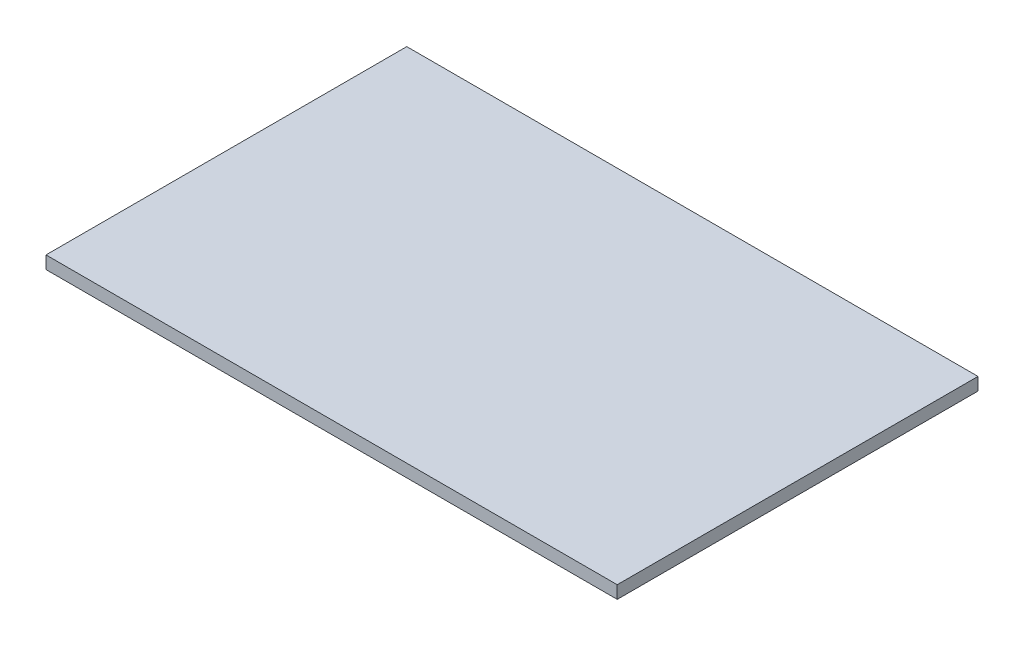
ISO-10303-21;
HEADER;
FILE_DESCRIPTION(('STEP AP214'),'2;1');
FILE_NAME('part.step','',(''),(''),'','','');
FILE_SCHEMA(('AUTOMOTIVE_DESIGN { 1 0 10303 214 1 1 1 1 }'));
ENDSEC;
DATA;
#1=APPLICATION_CONTEXT('core data for automotive mechanical design processes');
#2=APPLICATION_PROTOCOL_DEFINITION('international standard','automotive_design',2000,#1);
#3=PRODUCT_CONTEXT('',#1,'mechanical');
#4=PRODUCT('Part','Part','',(#3));
#5=PRODUCT_RELATED_PRODUCT_CATEGORY('part','',(#4));
#6=PRODUCT_DEFINITION_FORMATION('','',#4);
#7=PRODUCT_DEFINITION_CONTEXT('part definition',#1,'design');
#8=PRODUCT_DEFINITION('design','',#6,#7);
#9=PRODUCT_DEFINITION_SHAPE('','',#8);
#10=(LENGTH_UNIT() NAMED_UNIT(*) SI_UNIT(.MILLI.,.METRE.));
#11=(NAMED_UNIT(*) PLANE_ANGLE_UNIT() SI_UNIT($,.RADIAN.));
#12=(NAMED_UNIT(*) SI_UNIT($,.STERADIAN.) SOLID_ANGLE_UNIT());
#13=UNCERTAINTY_MEASURE_WITH_UNIT(LENGTH_MEASURE(1.E-05),#10,'distance_accuracy_value','');
#14=(GEOMETRIC_REPRESENTATION_CONTEXT(3) GLOBAL_UNCERTAINTY_ASSIGNED_CONTEXT((#13)) GLOBAL_UNIT_ASSIGNED_CONTEXT((#10,
#11,#12)) REPRESENTATION_CONTEXT('',''));
#15=CARTESIAN_POINT('',(0.,0.,0.));
#16=DIRECTION('',(0.,0.,1.));
#17=DIRECTION('',(1.,0.,0.));
#18=AXIS2_PLACEMENT_3D('',#15,#16,#17);
#19=CARTESIAN_POINT('',(0.,17.4625,0.));
#20=DIRECTION('',(1.,0.,0.));
#21=DIRECTION('',(0.,0.,-1.));
#22=AXIS2_PLACEMENT_3D('',#19,#20,#21);
#23=PLANE('',#22);
#24=DIRECTION('',(0.,0.,1.));
#25=VECTOR('',#24,1.);
#26=CARTESIAN_POINT('',(0.,0.,0.));
#27=LINE('',#26,#25);
#28=CARTESIAN_POINT('',(0.,0.,-495.3));
#29=VERTEX_POINT('',#28);
#30=CARTESIAN_POINT('',(0.,0.,0.));
#31=VERTEX_POINT('',#30);
#32=EDGE_CURVE('E96',#29,#31,#27,.T.);
#33=ORIENTED_EDGE('',*,*,#32,.T.);
#34=DIRECTION('',(0.,-1.,0.));
#35=VECTOR('',#34,1.);
#36=CARTESIAN_POINT('',(0.,17.4625,0.));
#37=LINE('',#36,#35);
#38=CARTESIAN_POINT('',(0.,17.4625,0.));
#39=VERTEX_POINT('',#38);
#40=EDGE_CURVE('E11',#39,#31,#37,.T.);
#41=ORIENTED_EDGE('',*,*,#40,.F.);
#42=DIRECTION('',(0.,0.,1.));
#43=VECTOR('',#42,1.);
#44=CARTESIAN_POINT('',(0.,17.4625,0.));
#45=LINE('',#44,#43);
#46=CARTESIAN_POINT('',(0.,17.4625,-495.3));
#47=VERTEX_POINT('',#46);
#48=EDGE_CURVE('E84',#47,#39,#45,.T.);
#49=ORIENTED_EDGE('',*,*,#48,.F.);
#50=DIRECTION('',(0.,-1.,0.));
#51=VECTOR('',#50,1.);
#52=CARTESIAN_POINT('',(0.,17.4625,-495.3));
#53=LINE('',#52,#51);
#54=EDGE_CURVE('E92',#47,#29,#53,.T.);
#55=ORIENTED_EDGE('',*,*,#54,.T.);
#56=EDGE_LOOP('',(#33,#41,#49,#55));
#57=FACE_BOUND('',#56,.T.);
#58=ADVANCED_FACE('F33',(#57),#23,.F.);
#59=CARTESIAN_POINT('',(0.,17.4625,0.));
#60=DIRECTION('',(0.,0.,-1.));
#61=DIRECTION('',(-1.,0.,0.));
#62=AXIS2_PLACEMENT_3D('',#59,#60,#61);
#63=PLANE('',#62);
#64=DIRECTION('',(1.,0.,0.));
#65=VECTOR('',#64,1.);
#66=CARTESIAN_POINT('',(0.,0.,0.));
#67=LINE('',#66,#65);
#68=CARTESIAN_POINT('',(784.225,0.,0.));
#69=VERTEX_POINT('',#68);
#70=EDGE_CURVE('E88',#31,#69,#67,.T.);
#71=ORIENTED_EDGE('',*,*,#70,.T.);
#72=DIRECTION('',(0.,-1.,0.));
#73=VECTOR('',#72,1.);
#74=CARTESIAN_POINT('',(784.225,17.4625,0.));
#75=LINE('',#74,#73);
#76=CARTESIAN_POINT('',(784.225,17.4625,0.));
#77=VERTEX_POINT('',#76);
#78=EDGE_CURVE('E41',#77,#69,#75,.T.);
#79=ORIENTED_EDGE('',*,*,#78,.F.);
#80=DIRECTION('',(1.,0.,0.));
#81=VECTOR('',#80,1.);
#82=CARTESIAN_POINT('',(0.,17.4625,0.));
#83=LINE('',#82,#81);
#84=EDGE_CURVE('E79',#39,#77,#83,.T.);
#85=ORIENTED_EDGE('',*,*,#84,.F.);
#86=ORIENTED_EDGE('',*,*,#40,.T.);
#87=EDGE_LOOP('',(#71,#79,#85,#86));
#88=FACE_BOUND('',#87,.T.);
#89=ADVANCED_FACE('F87',(#88),#63,.F.);
#90=CARTESIAN_POINT('',(784.225,17.4625,0.));
#91=DIRECTION('',(-1.,0.,0.));
#92=DIRECTION('',(0.,0.,1.));
#93=AXIS2_PLACEMENT_3D('',#90,#91,#92);
#94=PLANE('',#93);
#95=DIRECTION('',(0.,0.,-1.));
#96=VECTOR('',#95,1.);
#97=CARTESIAN_POINT('',(784.225,0.,0.));
#98=LINE('',#97,#96);
#99=CARTESIAN_POINT('',(784.225,0.,-495.3));
#100=VERTEX_POINT('',#99);
#101=EDGE_CURVE('E66',#69,#100,#98,.T.);
#102=ORIENTED_EDGE('',*,*,#101,.T.);
#103=DIRECTION('',(0.,-1.,0.));
#104=VECTOR('',#103,1.);
#105=CARTESIAN_POINT('',(784.225,17.4625,-495.3));
#106=LINE('',#105,#104);
#107=CARTESIAN_POINT('',(784.225,17.4625,-495.3));
#108=VERTEX_POINT('',#107);
#109=EDGE_CURVE('E89',#108,#100,#106,.T.);
#110=ORIENTED_EDGE('',*,*,#109,.F.);
#111=DIRECTION('',(0.,0.,-1.));
#112=VECTOR('',#111,1.);
#113=CARTESIAN_POINT('',(784.225,17.4625,0.));
#114=LINE('',#113,#112);
#115=EDGE_CURVE('E82',#77,#108,#114,.T.);
#116=ORIENTED_EDGE('',*,*,#115,.F.);
#117=ORIENTED_EDGE('',*,*,#78,.T.);
#118=EDGE_LOOP('',(#102,#110,#116,#117));
#119=FACE_BOUND('',#118,.T.);
#120=ADVANCED_FACE('F90',(#119),#94,.F.);
#121=CARTESIAN_POINT('',(0.,17.4625,-495.3));
#122=DIRECTION('',(0.,0.,1.));
#123=DIRECTION('',(1.,0.,0.));
#124=AXIS2_PLACEMENT_3D('',#121,#122,#123);
#125=PLANE('',#124);
#126=DIRECTION('',(-1.,0.,0.));
#127=VECTOR('',#126,1.);
#128=CARTESIAN_POINT('',(0.,0.,-495.3));
#129=LINE('',#128,#127);
#130=EDGE_CURVE('E72',#100,#29,#129,.T.);
#131=ORIENTED_EDGE('',*,*,#130,.T.);
#132=ORIENTED_EDGE('',*,*,#54,.F.);
#133=DIRECTION('',(-1.,0.,0.));
#134=VECTOR('',#133,1.);
#135=CARTESIAN_POINT('',(0.,17.4625,-495.3));
#136=LINE('',#135,#134);
#137=EDGE_CURVE('E49',#108,#47,#136,.T.);
#138=ORIENTED_EDGE('',*,*,#137,.F.);
#139=ORIENTED_EDGE('',*,*,#109,.T.);
#140=EDGE_LOOP('',(#131,#132,#138,#139));
#141=FACE_BOUND('',#140,.T.);
#142=ADVANCED_FACE('F103',(#141),#125,.F.);
#143=CARTESIAN_POINT('',(0.,17.4625,0.));
#144=DIRECTION('',(0.,-1.,0.));
#145=DIRECTION('',(0.,0.,-1.));
#146=AXIS2_PLACEMENT_3D('',#143,#144,#145);
#147=PLANE('',#146);
#148=ORIENTED_EDGE('',*,*,#48,.T.);
#149=ORIENTED_EDGE('',*,*,#84,.T.);
#150=ORIENTED_EDGE('',*,*,#115,.T.);
#151=ORIENTED_EDGE('',*,*,#137,.T.);
#152=EDGE_LOOP('',(#148,#149,#150,#151));
#153=FACE_BOUND('',#152,.T.);
#154=ADVANCED_FACE('F80',(#153),#147,.F.);
#155=CARTESIAN_POINT('',(0.,0.,0.));
#156=DIRECTION('',(0.,-1.,0.));
#157=DIRECTION('',(0.,0.,-1.));
#158=AXIS2_PLACEMENT_3D('',#155,#156,#157);
#159=PLANE('',#158);
#160=ORIENTED_EDGE('',*,*,#32,.F.);
#161=ORIENTED_EDGE('',*,*,#130,.F.);
#162=ORIENTED_EDGE('',*,*,#101,.F.);
#163=ORIENTED_EDGE('',*,*,#70,.F.);
#164=EDGE_LOOP('',(#160,#161,#162,#163));
#165=FACE_BOUND('',#164,.T.);
#166=ADVANCED_FACE('F106',(#165),#159,.T.);
#167=CLOSED_SHELL('',(#58,#89,#120,#142,#154,#166));
#168=MANIFOLD_SOLID_BREP('B2',#167);
#169=ADVANCED_BREP_SHAPE_REPRESENTATION('',(#18,#168),#14);
#170=SHAPE_DEFINITION_REPRESENTATION(#9,#169);
ENDSEC;
END-ISO-10303-21;
